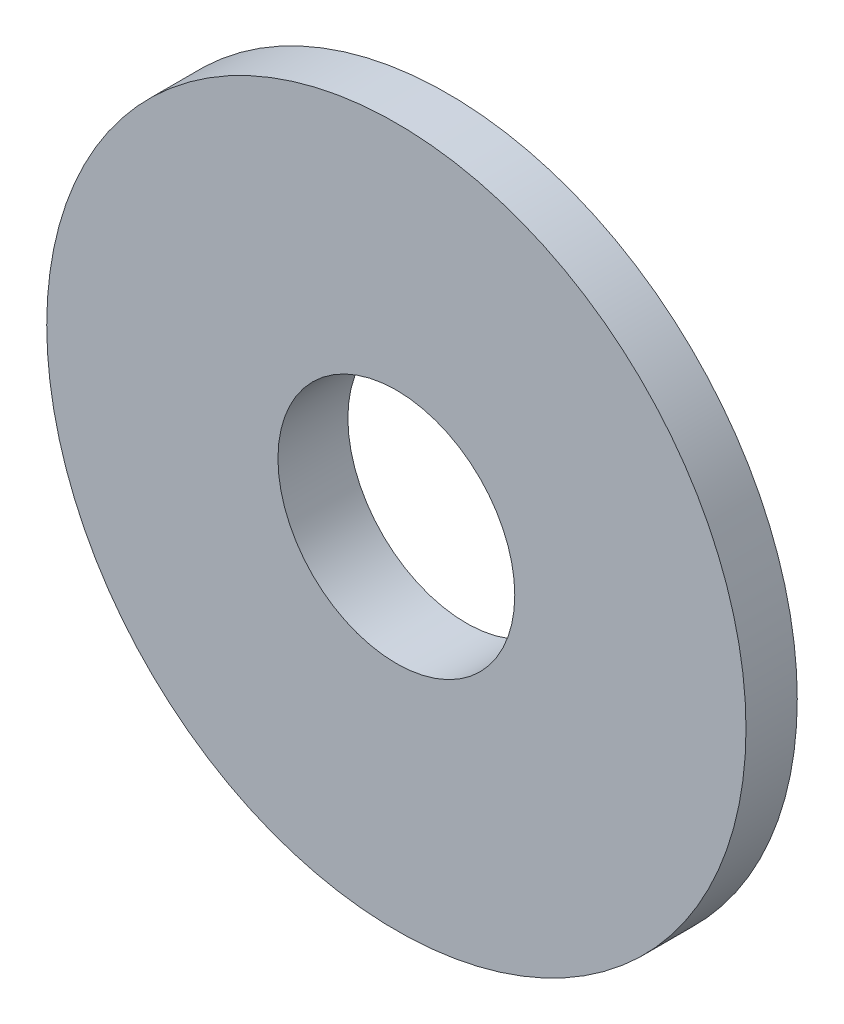
ISO-10303-21;
HEADER;
FILE_DESCRIPTION(('STEP AP214'),'2;1');
FILE_NAME('part.step','',(''),(''),'','','');
FILE_SCHEMA(('AUTOMOTIVE_DESIGN { 1 0 10303 214 1 1 1 1 }'));
ENDSEC;
DATA;
#1=APPLICATION_CONTEXT('core data for automotive mechanical design processes');
#2=APPLICATION_PROTOCOL_DEFINITION('international standard','automotive_design',2000,#1);
#3=PRODUCT_CONTEXT('',#1,'mechanical');
#4=PRODUCT('Part','Part','',(#3));
#5=PRODUCT_RELATED_PRODUCT_CATEGORY('part','',(#4));
#6=PRODUCT_DEFINITION_FORMATION('','',#4);
#7=PRODUCT_DEFINITION_CONTEXT('part definition',#1,'design');
#8=PRODUCT_DEFINITION('design','',#6,#7);
#9=PRODUCT_DEFINITION_SHAPE('','',#8);
#10=(LENGTH_UNIT() NAMED_UNIT(*) SI_UNIT(.MILLI.,.METRE.));
#11=(NAMED_UNIT(*) PLANE_ANGLE_UNIT() SI_UNIT($,.RADIAN.));
#12=(NAMED_UNIT(*) SI_UNIT($,.STERADIAN.) SOLID_ANGLE_UNIT());
#13=UNCERTAINTY_MEASURE_WITH_UNIT(LENGTH_MEASURE(1.E-05),#10,'distance_accuracy_value','');
#14=(GEOMETRIC_REPRESENTATION_CONTEXT(3) GLOBAL_UNCERTAINTY_ASSIGNED_CONTEXT((#13)) GLOBAL_UNIT_ASSIGNED_CONTEXT((#10,
#11,#12)) REPRESENTATION_CONTEXT('',''));
#15=CARTESIAN_POINT('',(0.,0.,0.));
#16=DIRECTION('',(0.,0.,1.));
#17=DIRECTION('',(1.,0.,0.));
#18=AXIS2_PLACEMENT_3D('',#15,#16,#17);
#19=CARTESIAN_POINT('',(0.,0.,0.));
#20=DIRECTION('',(0.,0.,1.));
#21=DIRECTION('',(1.,0.,0.));
#22=AXIS2_PLACEMENT_3D('',#19,#20,#21);
#23=PLANE('',#22);
#24=CARTESIAN_POINT('',(0.,0.,0.));
#25=DIRECTION('',(0.,0.,1.));
#26=DIRECTION('',(1.,0.,0.));
#27=AXIS2_PLACEMENT_3D('',#24,#25,#26);
#28=CIRCLE('',#27,9.525);
#29=CARTESIAN_POINT('',(9.525,0.,0.));
#30=VERTEX_POINT('',#29);
#31=EDGE_CURVE('E44',#30,#30,#28,.T.);
#32=ORIENTED_EDGE('',*,*,#31,.F.);
#33=EDGE_LOOP('',(#32));
#34=FACE_BOUND('',#33,.T.);
#35=CARTESIAN_POINT('',(0.,0.,0.));
#36=DIRECTION('',(0.,0.,1.));
#37=DIRECTION('',(1.,0.,0.));
#38=AXIS2_PLACEMENT_3D('',#35,#36,#37);
#39=CIRCLE('',#38,4.7625);
#40=CARTESIAN_POINT('',(4.7625,0.,0.));
#41=VERTEX_POINT('',#40);
#42=EDGE_CURVE('E10',#41,#41,#39,.F.);
#43=ORIENTED_EDGE('',*,*,#42,.F.);
#44=EDGE_LOOP('',(#43));
#45=FACE_BOUND('',#44,.T.);
#46=ADVANCED_FACE('F33',(#34,#45),#23,.F.);
#47=CARTESIAN_POINT('',(0.,0.,1.397));
#48=DIRECTION('',(0.,0.,1.));
#49=DIRECTION('',(1.,0.,0.));
#50=AXIS2_PLACEMENT_3D('',#47,#48,#49);
#51=PLANE('',#50);
#52=CARTESIAN_POINT('',(0.,0.,1.397));
#53=DIRECTION('',(0.,0.,1.));
#54=DIRECTION('',(1.,0.,0.));
#55=AXIS2_PLACEMENT_3D('',#52,#53,#54);
#56=CIRCLE('',#55,9.525);
#57=CARTESIAN_POINT('',(9.525,0.,1.397));
#58=VERTEX_POINT('',#57);
#59=EDGE_CURVE('E40',#58,#58,#56,.T.);
#60=ORIENTED_EDGE('',*,*,#59,.T.);
#61=EDGE_LOOP('',(#60));
#62=FACE_BOUND('',#61,.T.);
#63=CARTESIAN_POINT('',(0.,0.,1.397));
#64=DIRECTION('',(0.,0.,1.));
#65=DIRECTION('',(1.,0.,0.));
#66=AXIS2_PLACEMENT_3D('',#63,#64,#65);
#67=CIRCLE('',#66,3.2258);
#68=CARTESIAN_POINT('',(3.2258,0.,1.397));
#69=VERTEX_POINT('',#68);
#70=EDGE_CURVE('E49',#69,#69,#67,.T.);
#71=ORIENTED_EDGE('',*,*,#70,.F.);
#72=EDGE_LOOP('',(#71));
#73=FACE_BOUND('',#72,.T.);
#74=ADVANCED_FACE('F76',(#62,#73),#51,.T.);
#75=CARTESIAN_POINT('',(0.,0.,1.397));
#76=DIRECTION('',(0.,0.,-1.));
#77=DIRECTION('',(-1.,0.,0.));
#78=AXIS2_PLACEMENT_3D('',#75,#76,#77);
#79=CYLINDRICAL_SURFACE('',#78,9.525);
#80=ORIENTED_EDGE('',*,*,#59,.F.);
#81=EDGE_LOOP('',(#80));
#82=FACE_BOUND('',#81,.T.);
#83=ORIENTED_EDGE('',*,*,#31,.T.);
#84=EDGE_LOOP('',(#83));
#85=FACE_BOUND('',#84,.T.);
#86=ADVANCED_FACE('F35',(#82,#85),#79,.T.);
#87=CARTESIAN_POINT('',(0.,0.,1.397));
#88=DIRECTION('',(0.,0.,-1.));
#89=DIRECTION('',(-1.,0.,0.));
#90=AXIS2_PLACEMENT_3D('',#87,#88,#89);
#91=CYLINDRICAL_SURFACE('',#90,3.2258);
#92=ORIENTED_EDGE('',*,*,#70,.T.);
#93=EDGE_LOOP('',(#92));
#94=FACE_BOUND('',#93,.T.);
#95=CARTESIAN_POINT('',(0.,0.,-0.508));
#96=DIRECTION('',(0.,0.,-1.));
#97=DIRECTION('',(-1.,0.,0.));
#98=AXIS2_PLACEMENT_3D('',#95,#96,#97);
#99=CIRCLE('',#98,3.2258);
#100=CARTESIAN_POINT('',(-3.2258,0.,-0.508));
#101=VERTEX_POINT('',#100);
#102=EDGE_CURVE('E56',#101,#101,#99,.T.);
#103=ORIENTED_EDGE('',*,*,#102,.T.);
#104=EDGE_LOOP('',(#103));
#105=FACE_BOUND('',#104,.T.);
#106=ADVANCED_FACE('F60',(#94,#105),#91,.F.);
#107=CARTESIAN_POINT('',(0.,0.,-0.508));
#108=DIRECTION('',(0.,0.,-1.));
#109=DIRECTION('',(-1.,0.,0.));
#110=AXIS2_PLACEMENT_3D('',#107,#108,#109);
#111=PLANE('',#110);
#112=CARTESIAN_POINT('',(0.,0.,-0.508));
#113=DIRECTION('',(0.,0.,-1.));
#114=DIRECTION('',(-1.,0.,0.));
#115=AXIS2_PLACEMENT_3D('',#112,#113,#114);
#116=CIRCLE('',#115,4.7625);
#117=CARTESIAN_POINT('',(-4.7625,0.,-0.508));
#118=VERTEX_POINT('',#117);
#119=EDGE_CURVE('E53',#118,#118,#116,.T.);
#120=ORIENTED_EDGE('',*,*,#119,.T.);
#121=EDGE_LOOP('',(#120));
#122=FACE_BOUND('',#121,.T.);
#123=ORIENTED_EDGE('',*,*,#102,.F.);
#124=EDGE_LOOP('',(#123));
#125=FACE_BOUND('',#124,.T.);
#126=ADVANCED_FACE('F62',(#122,#125),#111,.T.);
#127=CARTESIAN_POINT('',(0.,0.,-0.508));
#128=DIRECTION('',(0.,0.,1.));
#129=DIRECTION('',(1.,0.,0.));
#130=AXIS2_PLACEMENT_3D('',#127,#128,#129);
#131=CYLINDRICAL_SURFACE('',#130,4.7625);
#132=ORIENTED_EDGE('',*,*,#119,.F.);
#133=EDGE_LOOP('',(#132));
#134=FACE_BOUND('',#133,.T.);
#135=ORIENTED_EDGE('',*,*,#42,.T.);
#136=EDGE_LOOP('',(#135));
#137=FACE_BOUND('',#136,.T.);
#138=ADVANCED_FACE('F64',(#134,#137),#131,.T.);
#139=CLOSED_SHELL('',(#46,#74,#86,#106,#126,#138));
#140=MANIFOLD_SOLID_BREP('B2',#139);
#141=ADVANCED_BREP_SHAPE_REPRESENTATION('',(#18,#140),#14);
#142=SHAPE_DEFINITION_REPRESENTATION(#9,#141);
ENDSEC;
END-ISO-10303-21;
